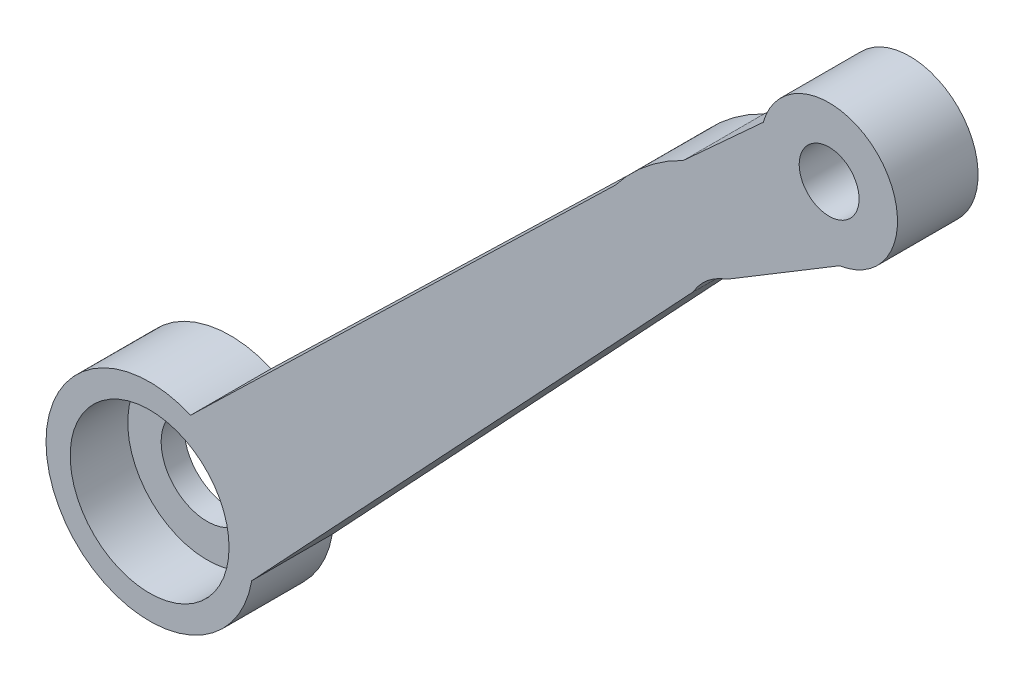
ISO-10303-21;
HEADER;
FILE_DESCRIPTION(('STEP AP214'),'2;1');
FILE_NAME('part.step','',(''),(''),'','','');
FILE_SCHEMA(('AUTOMOTIVE_DESIGN { 1 0 10303 214 1 1 1 1 }'));
ENDSEC;
DATA;
#1=APPLICATION_CONTEXT('core data for automotive mechanical design processes');
#2=APPLICATION_PROTOCOL_DEFINITION('international standard','automotive_design',2000,#1);
#3=PRODUCT_CONTEXT('',#1,'mechanical');
#4=PRODUCT('Part','Part','',(#3));
#5=PRODUCT_RELATED_PRODUCT_CATEGORY('part','',(#4));
#6=PRODUCT_DEFINITION_FORMATION('','',#4);
#7=PRODUCT_DEFINITION_CONTEXT('part definition',#1,'design');
#8=PRODUCT_DEFINITION('design','',#6,#7);
#9=PRODUCT_DEFINITION_SHAPE('','',#8);
#10=(LENGTH_UNIT() NAMED_UNIT(*) SI_UNIT(.MILLI.,.METRE.));
#11=(NAMED_UNIT(*) PLANE_ANGLE_UNIT() SI_UNIT($,.RADIAN.));
#12=(NAMED_UNIT(*) SI_UNIT($,.STERADIAN.) SOLID_ANGLE_UNIT());
#13=UNCERTAINTY_MEASURE_WITH_UNIT(LENGTH_MEASURE(1.E-05),#10,'distance_accuracy_value','');
#14=(GEOMETRIC_REPRESENTATION_CONTEXT(3) GLOBAL_UNCERTAINTY_ASSIGNED_CONTEXT((#13)) GLOBAL_UNIT_ASSIGNED_CONTEXT((#10,
#11,#12)) REPRESENTATION_CONTEXT('',''));
#15=CARTESIAN_POINT('',(0.,0.,0.));
#16=DIRECTION('',(0.,0.,1.));
#17=DIRECTION('',(1.,0.,0.));
#18=AXIS2_PLACEMENT_3D('',#15,#16,#17);
#19=CARTESIAN_POINT('',(-124.987033060666,-71.5953334018292,5.));
#20=DIRECTION('',(0.,0.,1.));
#21=DIRECTION('',(1.,0.,0.));
#22=AXIS2_PLACEMENT_3D('',#19,#20,#21);
#23=PLANE('',#22);
#24=CARTESIAN_POINT('',(-65.9691971319888,-18.0264477850223,5.));
#25=DIRECTION('',(0.,0.,1.));
#26=DIRECTION('',(1.,0.,0.));
#27=AXIS2_PLACEMENT_3D('',#24,#25,#26);
#28=CIRCLE('',#27,2.6);
#29=CARTESIAN_POINT('',(-63.3691971319888,-18.0264477850223,5.));
#30=VERTEX_POINT('',#29);
#31=EDGE_CURVE('E166',#30,#30,#28,.T.);
#32=ORIENTED_EDGE('',*,*,#31,.F.);
#33=EDGE_LOOP('',(#32));
#34=FACE_BOUND('',#33,.T.);
#35=CARTESIAN_POINT('',(-124.987033060666,-71.5953334018292,5.));
#36=DIRECTION('',(0.,0.,1.));
#37=DIRECTION('',(1.,0.,0.));
#38=AXIS2_PLACEMENT_3D('',#35,#36,#37);
#39=CIRCLE('',#38,8.99999999999999);
#40=CARTESIAN_POINT('',(-121.430579380583,-63.3278285048592,5.));
#41=VERTEX_POINT('',#40);
#42=CARTESIAN_POINT('',(-116.1164594661,-73.1161634723462,5.));
#43=VERTEX_POINT('',#42);
#44=EDGE_CURVE('E113',#41,#43,#39,.T.);
#45=ORIENTED_EDGE('',*,*,#44,.T.);
#46=DIRECTION('',(0.683917048390765,0.729559778853291,0.));
#47=VECTOR('',#46,1.);
#48=CARTESIAN_POINT('',(-116.1164594661,-73.1161634723462,5.));
#49=LINE('',#48,#47);
#50=CARTESIAN_POINT('',(-77.7803956143709,-32.2216568482133,5.));
#51=VERTEX_POINT('',#50);
#52=EDGE_CURVE('E175',#43,#51,#49,.T.);
#53=ORIENTED_EDGE('',*,*,#52,.T.);
#54=CARTESIAN_POINT('',(-73.0977404303763,-34.9110323199174,5.));
#55=DIRECTION('',(0.,0.,-1.));
#56=DIRECTION('',(1.,0.,0.));
#57=AXIS2_PLACEMENT_3D('',#54,#55,#56);
#58=CIRCLE('',#57,5.3999999999995);
#59=CARTESIAN_POINT('',(-74.8335154636347,-29.7976102726078,5.));
#60=VERTEX_POINT('',#59);
#61=EDGE_CURVE('E178',#51,#60,#58,.T.);
#62=ORIENTED_EDGE('',*,*,#61,.T.);
#63=DIRECTION('',(0.856088074759195,0.51682996067865,0.));
#64=VECTOR('',#63,1.);
#65=CARTESIAN_POINT('',(-74.8335154636347,-29.7976102726078,5.));
#66=LINE('',#65,#64);
#67=CARTESIAN_POINT('',(-65.0582692039829,-23.8961846028003,5.));
#68=VERTEX_POINT('',#67);
#69=EDGE_CURVE('E181',#60,#68,#66,.T.);
#70=ORIENTED_EDGE('',*,*,#69,.T.);
#71=CARTESIAN_POINT('',(-65.9691971319888,-18.0264477850223,5.));
#72=DIRECTION('',(0.,0.,1.));
#73=DIRECTION('',(1.,0.,0.));
#74=AXIS2_PLACEMENT_3D('',#71,#72,#73);
#75=CIRCLE('',#74,5.94000000000004);
#76=CARTESIAN_POINT('',(-71.6871646112254,-16.4175823753646,5.));
#77=VERTEX_POINT('',#76);
#78=EDGE_CURVE('E184',#68,#77,#75,.T.);
#79=ORIENTED_EDGE('',*,*,#78,.T.);
#80=DIRECTION('',(-0.738432343533464,-0.674327571751057,0.));
#81=VECTOR('',#80,1.);
#82=CARTESIAN_POINT('',(-71.6871646112254,-16.4175823753646,5.));
#83=LINE('',#82,#81);
#84=CARTESIAN_POINT('',(-78.6359414645846,-22.7631221708506,5.));
#85=VERTEX_POINT('',#84);
#86=EDGE_CURVE('E187',#77,#85,#83,.T.);
#87=ORIENTED_EDGE('',*,*,#86,.T.);
#88=CARTESIAN_POINT('',(-71.4000509723581,-37.6650229871914,5.));
#89=DIRECTION('',(0.,0.,1.));
#90=DIRECTION('',(1.,0.,0.));
#91=AXIS2_PLACEMENT_3D('',#88,#89,#90);
#92=CIRCLE('',#91,16.5657707081666);
#93=CARTESIAN_POINT('',(-84.5297017660568,-27.5636849970498,5.));
#94=VERTEX_POINT('',#93);
#95=EDGE_CURVE('E64',#85,#94,#92,.T.);
#96=ORIENTED_EDGE('',*,*,#95,.T.);
#97=DIRECTION('',(-0.718080536459822,-0.695960015487653,0.));
#98=VECTOR('',#97,1.);
#99=CARTESIAN_POINT('',(-84.5297017660568,-27.5636849970498,5.));
#100=LINE('',#99,#98);
#101=EDGE_CURVE('E59',#94,#41,#100,.T.);
#102=ORIENTED_EDGE('',*,*,#101,.T.);
#103=EDGE_LOOP('',(#45,#53,#62,#70,#79,#87,#96,#102));
#104=FACE_BOUND('',#103,.T.);
#105=CARTESIAN_POINT('',(-124.987033060666,-71.5953334018292,5.));
#106=DIRECTION('',(0.,0.,1.));
#107=DIRECTION('',(1.,0.,0.));
#108=AXIS2_PLACEMENT_3D('',#105,#106,#107);
#109=CIRCLE('',#108,6.90000000000001);
#110=CARTESIAN_POINT('',(-118.087033060666,-71.5953334018292,5.));
#111=VERTEX_POINT('',#110);
#112=EDGE_CURVE('E162',#111,#111,#109,.T.);
#113=ORIENTED_EDGE('',*,*,#112,.F.);
#114=EDGE_LOOP('',(#113));
#115=FACE_BOUND('',#114,.T.);
#116=ADVANCED_FACE('F43',(#34,#104,#115),#23,.T.);
#117=CARTESIAN_POINT('',(-124.987033060666,-71.5953334018292,5.));
#118=DIRECTION('',(0.,0.,-1.));
#119=DIRECTION('',(-1.,0.,0.));
#120=AXIS2_PLACEMENT_3D('',#117,#118,#119);
#121=CYLINDRICAL_SURFACE('',#120,8.99999999999999);
#122=DIRECTION('',(0.,0.,-1.));
#123=VECTOR('',#122,1.);
#124=CARTESIAN_POINT('',(-121.430579380583,-63.3278285048592,5.));
#125=LINE('',#124,#123);
#126=CARTESIAN_POINT('',(-121.430579380583,-63.3278285048592,-2.));
#127=VERTEX_POINT('',#126);
#128=EDGE_CURVE('E108',#41,#127,#125,.T.);
#129=ORIENTED_EDGE('',*,*,#128,.T.);
#130=CARTESIAN_POINT('',(-124.987033060666,-71.5953334018292,-2.));
#131=DIRECTION('',(0.,0.,-1.));
#132=DIRECTION('',(-1.,0.,0.));
#133=AXIS2_PLACEMENT_3D('',#130,#131,#132);
#134=CIRCLE('',#133,8.99999999999999);
#135=CARTESIAN_POINT('',(-116.1164594661,-73.1161634723462,-2.));
#136=VERTEX_POINT('',#135);
#137=EDGE_CURVE('E112',#136,#127,#134,.T.);
#138=ORIENTED_EDGE('',*,*,#137,.F.);
#139=DIRECTION('',(0.,0.,-1.));
#140=VECTOR('',#139,1.);
#141=CARTESIAN_POINT('',(-116.1164594661,-73.1161634723462,5.));
#142=LINE('',#141,#140);
#143=EDGE_CURVE('E11',#43,#136,#142,.T.);
#144=ORIENTED_EDGE('',*,*,#143,.F.);
#145=ORIENTED_EDGE('',*,*,#44,.F.);
#146=EDGE_LOOP('',(#129,#138,#144,#145));
#147=FACE_BOUND('',#146,.T.);
#148=ADVANCED_FACE('F45',(#147),#121,.T.);
#149=CARTESIAN_POINT('',(-116.1164594661,-73.1161634723462,5.));
#150=DIRECTION('',(-0.729559778853291,0.683917048390765,0.));
#151=DIRECTION('',(-0.683917048390765,-0.729559778853291,0.));
#152=AXIS2_PLACEMENT_3D('',#149,#150,#151);
#153=PLANE('',#152);
#154=ORIENTED_EDGE('',*,*,#143,.T.);
#155=DIRECTION('',(-0.683917048390765,-0.729559778853291,0.));
#156=VECTOR('',#155,1.);
#157=CARTESIAN_POINT('',(-77.7803956143709,-32.2216568482133,-2.));
#158=LINE('',#157,#156);
#159=CARTESIAN_POINT('',(-77.7803956143709,-32.2216568482133,-2.));
#160=VERTEX_POINT('',#159);
#161=EDGE_CURVE('E132',#160,#136,#158,.T.);
#162=ORIENTED_EDGE('',*,*,#161,.F.);
#163=DIRECTION('',(0.,0.,-1.));
#164=VECTOR('',#163,1.);
#165=CARTESIAN_POINT('',(-77.7803956143709,-32.2216568482133,5.));
#166=LINE('',#165,#164);
#167=EDGE_CURVE('E52',#51,#160,#166,.T.);
#168=ORIENTED_EDGE('',*,*,#167,.F.);
#169=ORIENTED_EDGE('',*,*,#52,.F.);
#170=EDGE_LOOP('',(#154,#162,#168,#169));
#171=FACE_BOUND('',#170,.T.);
#172=ADVANCED_FACE('F216',(#171),#153,.F.);
#173=CARTESIAN_POINT('',(-73.0977404303763,-34.9110323199174,5.));
#174=DIRECTION('',(0.,0.,-1.));
#175=DIRECTION('',(-1.,0.,0.));
#176=AXIS2_PLACEMENT_3D('',#173,#174,#175);
#177=CYLINDRICAL_SURFACE('',#176,5.3999999999995);
#178=ORIENTED_EDGE('',*,*,#167,.T.);
#179=CARTESIAN_POINT('',(-73.0977404303763,-34.9110323199174,-2.));
#180=DIRECTION('',(0.,0.,1.));
#181=DIRECTION('',(-1.,0.,0.));
#182=AXIS2_PLACEMENT_3D('',#179,#180,#181);
#183=CIRCLE('',#182,5.3999999999995);
#184=CARTESIAN_POINT('',(-74.8335154636347,-29.7976102726078,-2.));
#185=VERTEX_POINT('',#184);
#186=EDGE_CURVE('E156',#185,#160,#183,.T.);
#187=ORIENTED_EDGE('',*,*,#186,.F.);
#188=DIRECTION('',(0.,0.,-1.));
#189=VECTOR('',#188,1.);
#190=CARTESIAN_POINT('',(-74.8335154636347,-29.7976102726078,5.));
#191=LINE('',#190,#189);
#192=EDGE_CURVE('E205',#60,#185,#191,.T.);
#193=ORIENTED_EDGE('',*,*,#192,.F.);
#194=ORIENTED_EDGE('',*,*,#61,.F.);
#195=EDGE_LOOP('',(#178,#187,#193,#194));
#196=FACE_BOUND('',#195,.T.);
#197=ADVANCED_FACE('F212',(#196),#177,.F.);
#198=CARTESIAN_POINT('',(-74.8335154636347,-29.7976102726078,5.));
#199=DIRECTION('',(-0.51682996067865,0.856088074759195,0.));
#200=DIRECTION('',(-0.856088074759195,-0.51682996067865,0.));
#201=AXIS2_PLACEMENT_3D('',#198,#199,#200);
#202=PLANE('',#201);
#203=ORIENTED_EDGE('',*,*,#192,.T.);
#204=DIRECTION('',(-0.856088074759194,-0.516829960678652,0.));
#205=VECTOR('',#204,1.);
#206=CARTESIAN_POINT('',(-65.0582692039829,-23.8961846028003,-2.));
#207=LINE('',#206,#205);
#208=CARTESIAN_POINT('',(-65.0582692039829,-23.8961846028003,-2.));
#209=VERTEX_POINT('',#208);
#210=EDGE_CURVE('E152',#209,#185,#207,.T.);
#211=ORIENTED_EDGE('',*,*,#210,.F.);
#212=DIRECTION('',(0.,0.,-1.));
#213=VECTOR('',#212,1.);
#214=CARTESIAN_POINT('',(-65.0582692039829,-23.8961846028003,5.));
#215=LINE('',#214,#213);
#216=EDGE_CURVE('E202',#68,#209,#215,.T.);
#217=ORIENTED_EDGE('',*,*,#216,.F.);
#218=ORIENTED_EDGE('',*,*,#69,.F.);
#219=EDGE_LOOP('',(#203,#211,#217,#218));
#220=FACE_BOUND('',#219,.T.);
#221=ADVANCED_FACE('F259',(#220),#202,.F.);
#222=CARTESIAN_POINT('',(-65.9691971319888,-18.0264477850223,5.));
#223=DIRECTION('',(0.,0.,-1.));
#224=DIRECTION('',(-1.,0.,0.));
#225=AXIS2_PLACEMENT_3D('',#222,#223,#224);
#226=CYLINDRICAL_SURFACE('',#225,5.94000000000004);
#227=ORIENTED_EDGE('',*,*,#216,.T.);
#228=CARTESIAN_POINT('',(-65.9691971319888,-18.0264477850223,-2.));
#229=DIRECTION('',(0.,0.,-1.));
#230=DIRECTION('',(-1.,0.,0.));
#231=AXIS2_PLACEMENT_3D('',#228,#229,#230);
#232=CIRCLE('',#231,5.94000000000001);
#233=CARTESIAN_POINT('',(-71.6871646112254,-16.4175823753646,-2.));
#234=VERTEX_POINT('',#233);
#235=EDGE_CURVE('E148',#234,#209,#232,.T.);
#236=ORIENTED_EDGE('',*,*,#235,.F.);
#237=DIRECTION('',(0.,0.,-1.));
#238=VECTOR('',#237,1.);
#239=CARTESIAN_POINT('',(-71.6871646112254,-16.4175823753646,5.));
#240=LINE('',#239,#238);
#241=EDGE_CURVE('E199',#77,#234,#240,.T.);
#242=ORIENTED_EDGE('',*,*,#241,.F.);
#243=ORIENTED_EDGE('',*,*,#78,.F.);
#244=EDGE_LOOP('',(#227,#236,#242,#243));
#245=FACE_BOUND('',#244,.T.);
#246=ADVANCED_FACE('F255',(#245),#226,.T.);
#247=CARTESIAN_POINT('',(-71.6871646112254,-16.4175823753646,5.));
#248=DIRECTION('',(0.674327571751057,-0.738432343533464,0.));
#249=DIRECTION('',(0.738432343533464,0.674327571751057,0.));
#250=AXIS2_PLACEMENT_3D('',#247,#248,#249);
#251=PLANE('',#250);
#252=ORIENTED_EDGE('',*,*,#241,.T.);
#253=DIRECTION('',(0.738432343533464,0.674327571751057,0.));
#254=VECTOR('',#253,1.);
#255=CARTESIAN_POINT('',(-78.6359414645846,-22.7631221708506,-2.));
#256=LINE('',#255,#254);
#257=CARTESIAN_POINT('',(-78.6359414645846,-22.7631221708506,-2.));
#258=VERTEX_POINT('',#257);
#259=EDGE_CURVE('E144',#258,#234,#256,.T.);
#260=ORIENTED_EDGE('',*,*,#259,.F.);
#261=DIRECTION('',(0.,0.,-1.));
#262=VECTOR('',#261,1.);
#263=CARTESIAN_POINT('',(-78.6359414645846,-22.7631221708506,5.));
#264=LINE('',#263,#262);
#265=EDGE_CURVE('E196',#85,#258,#264,.T.);
#266=ORIENTED_EDGE('',*,*,#265,.F.);
#267=ORIENTED_EDGE('',*,*,#86,.F.);
#268=EDGE_LOOP('',(#252,#260,#266,#267));
#269=FACE_BOUND('',#268,.T.);
#270=ADVANCED_FACE('F251',(#269),#251,.F.);
#271=CARTESIAN_POINT('',(-71.4000509723581,-37.6650229871914,5.));
#272=DIRECTION('',(0.,0.,-1.));
#273=DIRECTION('',(-1.,0.,0.));
#274=AXIS2_PLACEMENT_3D('',#271,#272,#273);
#275=CYLINDRICAL_SURFACE('',#274,16.5657707081666);
#276=ORIENTED_EDGE('',*,*,#265,.T.);
#277=CARTESIAN_POINT('',(-71.4000509723581,-37.6650229871914,-2.));
#278=DIRECTION('',(0.,0.,-1.));
#279=DIRECTION('',(-1.,0.,0.));
#280=AXIS2_PLACEMENT_3D('',#277,#278,#279);
#281=CIRCLE('',#280,16.5657707081666);
#282=CARTESIAN_POINT('',(-84.5297017660568,-27.5636849970498,-2.));
#283=VERTEX_POINT('',#282);
#284=EDGE_CURVE('E125',#283,#258,#281,.T.);
#285=ORIENTED_EDGE('',*,*,#284,.F.);
#286=DIRECTION('',(0.,0.,-1.));
#287=VECTOR('',#286,1.);
#288=CARTESIAN_POINT('',(-84.5297017660568,-27.5636849970498,5.));
#289=LINE('',#288,#287);
#290=EDGE_CURVE('E116',#94,#283,#289,.T.);
#291=ORIENTED_EDGE('',*,*,#290,.F.);
#292=ORIENTED_EDGE('',*,*,#95,.F.);
#293=EDGE_LOOP('',(#276,#285,#291,#292));
#294=FACE_BOUND('',#293,.T.);
#295=ADVANCED_FACE('F248',(#294),#275,.T.);
#296=CARTESIAN_POINT('',(-84.5297017660568,-27.5636849970498,5.));
#297=DIRECTION('',(0.695960015487653,-0.718080536459822,0.));
#298=DIRECTION('',(0.718080536459822,0.695960015487653,0.));
#299=AXIS2_PLACEMENT_3D('',#296,#297,#298);
#300=PLANE('',#299);
#301=ORIENTED_EDGE('',*,*,#290,.T.);
#302=DIRECTION('',(0.718080536459822,0.695960015487653,0.));
#303=VECTOR('',#302,1.);
#304=CARTESIAN_POINT('',(-121.430579380583,-63.3278285048592,-2.));
#305=LINE('',#304,#303);
#306=EDGE_CURVE('E119',#127,#283,#305,.T.);
#307=ORIENTED_EDGE('',*,*,#306,.F.);
#308=ORIENTED_EDGE('',*,*,#128,.F.);
#309=ORIENTED_EDGE('',*,*,#101,.F.);
#310=EDGE_LOOP('',(#301,#307,#308,#309));
#311=FACE_BOUND('',#310,.T.);
#312=ADVANCED_FACE('F120',(#311),#300,.F.);
#313=CARTESIAN_POINT('',(-65.9691971319888,-18.0264477850223,5.));
#314=DIRECTION('',(0.,0.,-1.));
#315=DIRECTION('',(-1.,0.,0.));
#316=AXIS2_PLACEMENT_3D('',#313,#314,#315);
#317=CYLINDRICAL_SURFACE('',#316,2.6);
#318=ORIENTED_EDGE('',*,*,#31,.T.);
#319=EDGE_LOOP('',(#318));
#320=FACE_BOUND('',#319,.T.);
#321=CARTESIAN_POINT('',(-65.9691971319888,-18.0264477850223,-2.));
#322=DIRECTION('',(0.,0.,-1.));
#323=DIRECTION('',(-1.,0.,0.));
#324=AXIS2_PLACEMENT_3D('',#321,#322,#323);
#325=CIRCLE('',#324,2.6);
#326=CARTESIAN_POINT('',(-68.5691971319888,-18.0264477850223,-2.));
#327=VERTEX_POINT('',#326);
#328=EDGE_CURVE('E398',#327,#327,#325,.T.);
#329=ORIENTED_EDGE('',*,*,#328,.T.);
#330=EDGE_LOOP('',(#329));
#331=FACE_BOUND('',#330,.T.);
#332=ADVANCED_FACE('F227',(#320,#331),#317,.F.);
#333=CARTESIAN_POINT('',(-124.987033060666,-71.5953334018292,5.));
#334=DIRECTION('',(0.,0.,-1.));
#335=DIRECTION('',(-1.,0.,0.));
#336=AXIS2_PLACEMENT_3D('',#333,#334,#335);
#337=CYLINDRICAL_SURFACE('',#336,6.90000000000001);
#338=ORIENTED_EDGE('',*,*,#112,.T.);
#339=EDGE_LOOP('',(#338));
#340=FACE_BOUND('',#339,.T.);
#341=CARTESIAN_POINT('',(-124.987033060666,-71.5953334018292,0.));
#342=DIRECTION('',(0.,0.,1.));
#343=DIRECTION('',(1.,0.,0.));
#344=AXIS2_PLACEMENT_3D('',#341,#342,#343);
#345=CIRCLE('',#344,6.90000000000001);
#346=CARTESIAN_POINT('',(-118.087033060666,-71.5953334018292,0.));
#347=VERTEX_POINT('',#346);
#348=EDGE_CURVE('E161',#347,#347,#345,.T.);
#349=ORIENTED_EDGE('',*,*,#348,.F.);
#350=EDGE_LOOP('',(#349));
#351=FACE_BOUND('',#350,.T.);
#352=ADVANCED_FACE('F223',(#340,#351),#337,.F.);
#353=CARTESIAN_POINT('',(-124.987033060666,-71.5953334018292,0.));
#354=DIRECTION('',(0.,0.,-1.));
#355=DIRECTION('',(-1.,0.,0.));
#356=AXIS2_PLACEMENT_3D('',#353,#354,#355);
#357=PLANE('',#356);
#358=CARTESIAN_POINT('',(-124.987033060666,-71.5953334018292,0.));
#359=DIRECTION('',(0.,0.,-1.));
#360=DIRECTION('',(-1.,0.,0.));
#361=AXIS2_PLACEMENT_3D('',#358,#359,#360);
#362=CIRCLE('',#361,3.99999999999998);
#363=CARTESIAN_POINT('',(-128.987033060666,-71.5953334018292,0.));
#364=VERTEX_POINT('',#363);
#365=EDGE_CURVE('E138',#364,#364,#362,.T.);
#366=ORIENTED_EDGE('',*,*,#365,.T.);
#367=EDGE_LOOP('',(#366));
#368=FACE_BOUND('',#367,.T.);
#369=ORIENTED_EDGE('',*,*,#348,.T.);
#370=EDGE_LOOP('',(#369));
#371=FACE_BOUND('',#370,.T.);
#372=ADVANCED_FACE('F226',(#368,#371),#357,.F.);
#373=CARTESIAN_POINT('',(-124.987033060666,-71.5953334018292,-2.));
#374=DIRECTION('',(0.,0.,-1.));
#375=DIRECTION('',(-1.,0.,0.));
#376=AXIS2_PLACEMENT_3D('',#373,#374,#375);
#377=PLANE('',#376);
#378=CARTESIAN_POINT('',(-124.987033060666,-71.5953334018292,-2.));
#379=DIRECTION('',(0.,0.,-1.));
#380=DIRECTION('',(-1.,0.,0.));
#381=AXIS2_PLACEMENT_3D('',#378,#379,#380);
#382=CIRCLE('',#381,3.99999999999998);
#383=CARTESIAN_POINT('',(-128.987033060666,-71.5953334018292,-2.));
#384=VERTEX_POINT('',#383);
#385=EDGE_CURVE('E134',#384,#384,#382,.T.);
#386=ORIENTED_EDGE('',*,*,#385,.F.);
#387=EDGE_LOOP('',(#386));
#388=FACE_BOUND('',#387,.T.);
#389=ORIENTED_EDGE('',*,*,#137,.T.);
#390=ORIENTED_EDGE('',*,*,#306,.T.);
#391=ORIENTED_EDGE('',*,*,#284,.T.);
#392=ORIENTED_EDGE('',*,*,#259,.T.);
#393=ORIENTED_EDGE('',*,*,#235,.T.);
#394=ORIENTED_EDGE('',*,*,#210,.T.);
#395=ORIENTED_EDGE('',*,*,#186,.T.);
#396=ORIENTED_EDGE('',*,*,#161,.T.);
#397=EDGE_LOOP('',(#389,#390,#391,#392,#393,#394,#395,#396));
#398=FACE_BOUND('',#397,.T.);
#399=ORIENTED_EDGE('',*,*,#328,.F.);
#400=EDGE_LOOP('',(#399));
#401=FACE_BOUND('',#400,.T.);
#402=ADVANCED_FACE('F128',(#388,#398,#401),#377,.T.);
#403=CARTESIAN_POINT('',(-124.987033060666,-71.5953334018292,-2.));
#404=DIRECTION('',(0.,0.,1.));
#405=DIRECTION('',(1.,0.,0.));
#406=AXIS2_PLACEMENT_3D('',#403,#404,#405);
#407=CYLINDRICAL_SURFACE('',#406,3.99999999999998);
#408=ORIENTED_EDGE('',*,*,#385,.T.);
#409=EDGE_LOOP('',(#408));
#410=FACE_BOUND('',#409,.T.);
#411=ORIENTED_EDGE('',*,*,#365,.F.);
#412=EDGE_LOOP('',(#411));
#413=FACE_BOUND('',#412,.T.);
#414=ADVANCED_FACE('F237',(#410,#413),#407,.F.);
#415=CLOSED_SHELL('',(#116,#148,#172,#197,#221,#246,#270,#295,#312,#332,#352,#372,#402,#414));
#416=MANIFOLD_SOLID_BREP('B2',#415);
#417=ADVANCED_BREP_SHAPE_REPRESENTATION('',(#18,#416),#14);
#418=SHAPE_DEFINITION_REPRESENTATION(#9,#417);
ENDSEC;
END-ISO-10303-21;
